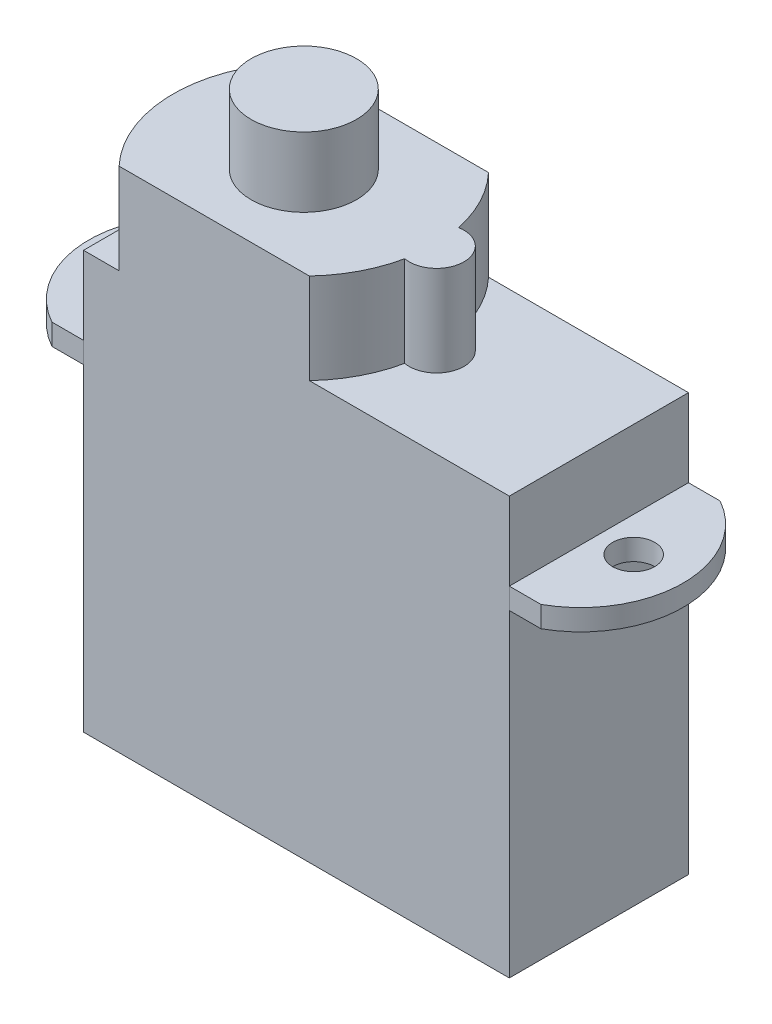
ISO-10303-21;
HEADER;
FILE_DESCRIPTION(('STEP AP214'),'2;1');
FILE_NAME('part.step','',(''),(''),'','','');
FILE_SCHEMA(('AUTOMOTIVE_DESIGN { 1 0 10303 214 1 1 1 1 }'));
ENDSEC;
DATA;
#1=APPLICATION_CONTEXT('core data for automotive mechanical design processes');
#2=APPLICATION_PROTOCOL_DEFINITION('international standard','automotive_design',2000,#1);
#3=PRODUCT_CONTEXT('',#1,'mechanical');
#4=PRODUCT('Part','Part','',(#3));
#5=PRODUCT_RELATED_PRODUCT_CATEGORY('part','',(#4));
#6=PRODUCT_DEFINITION_FORMATION('','',#4);
#7=PRODUCT_DEFINITION_CONTEXT('part definition',#1,'design');
#8=PRODUCT_DEFINITION('design','',#6,#7);
#9=PRODUCT_DEFINITION_SHAPE('','',#8);
#10=(LENGTH_UNIT() NAMED_UNIT(*) SI_UNIT(.MILLI.,.METRE.));
#11=(NAMED_UNIT(*) PLANE_ANGLE_UNIT() SI_UNIT($,.RADIAN.));
#12=(NAMED_UNIT(*) SI_UNIT($,.STERADIAN.) SOLID_ANGLE_UNIT());
#13=UNCERTAINTY_MEASURE_WITH_UNIT(LENGTH_MEASURE(1.E-05),#10,'distance_accuracy_value','');
#14=(GEOMETRIC_REPRESENTATION_CONTEXT(3) GLOBAL_UNCERTAINTY_ASSIGNED_CONTEXT((#13)) GLOBAL_UNIT_ASSIGNED_CONTEXT((#10,
#11,#12)) REPRESENTATION_CONTEXT('',''));
#15=CARTESIAN_POINT('',(0.,0.,0.));
#16=DIRECTION('',(0.,0.,1.));
#17=DIRECTION('',(1.,0.,0.));
#18=AXIS2_PLACEMENT_3D('',#15,#16,#17);
#19=CARTESIAN_POINT('',(-12.4,4.5,1.2));
#20=DIRECTION('',(1.,0.,0.));
#21=DIRECTION('',(0.,0.,-1.));
#22=AXIS2_PLACEMENT_3D('',#19,#20,#21);
#23=CYLINDRICAL_SURFACE('',#22,0.6);
#24=CARTESIAN_POINT('',(-12.4,4.5,1.2));
#25=DIRECTION('',(-1.,0.,0.));
#26=DIRECTION('',(0.,0.,1.));
#27=AXIS2_PLACEMENT_3D('',#24,#25,#26);
#28=CIRCLE('',#27,0.6);
#29=CARTESIAN_POINT('',(-12.4,4.5,1.8));
#30=VERTEX_POINT('',#29);
#31=EDGE_CURVE('E12',#30,#30,#28,.T.);
#32=ORIENTED_EDGE('',*,*,#31,.F.);
#33=EDGE_LOOP('',(#32));
#34=FACE_BOUND('',#33,.T.);
#35=CARTESIAN_POINT('',(-10.1,4.5,1.2));
#36=DIRECTION('',(-1.,0.,0.));
#37=DIRECTION('',(0.,0.,1.));
#38=AXIS2_PLACEMENT_3D('',#35,#36,#37);
#39=CIRCLE('',#38,0.6);
#40=CARTESIAN_POINT('',(-10.1,4.5,1.8));
#41=VERTEX_POINT('',#40);
#42=EDGE_CURVE('E68',#41,#41,#39,.T.);
#43=ORIENTED_EDGE('',*,*,#42,.T.);
#44=EDGE_LOOP('',(#43));
#45=FACE_BOUND('',#44,.T.);
#46=ADVANCED_FACE('F65',(#34,#45),#23,.T.);
#47=CARTESIAN_POINT('',(-12.4,0.,0.));
#48=DIRECTION('',(-1.,0.,0.));
#49=DIRECTION('',(0.,0.,1.));
#50=AXIS2_PLACEMENT_3D('',#47,#48,#49);
#51=PLANE('',#50);
#52=ORIENTED_EDGE('',*,*,#31,.T.);
#53=EDGE_LOOP('',(#52));
#54=FACE_BOUND('',#53,.T.);
#55=ADVANCED_FACE('F80',(#54),#51,.T.);
#56=CARTESIAN_POINT('',(-10.1,0.,0.));
#57=DIRECTION('',(-1.,0.,0.));
#58=DIRECTION('',(0.,0.,1.));
#59=AXIS2_PLACEMENT_3D('',#56,#57,#58);
#60=PLANE('',#59);
#61=ORIENTED_EDGE('',*,*,#42,.F.);
#62=EDGE_LOOP('',(#61));
#63=FACE_BOUND('',#62,.T.);
#64=ADVANCED_FACE('F78',(#63),#60,.F.);
#65=CLOSED_SHELL('',(#46,#55,#64));
#66=MANIFOLD_SOLID_BREP('B2',#65);
#67=CARTESIAN_POINT('',(-12.4,4.5,-1.2));
#68=DIRECTION('',(1.,0.,0.));
#69=DIRECTION('',(0.,0.,-1.));
#70=AXIS2_PLACEMENT_3D('',#67,#68,#69);
#71=CYLINDRICAL_SURFACE('',#70,0.6);
#72=CARTESIAN_POINT('',(-12.4,4.5,-1.2));
#73=DIRECTION('',(-1.,0.,0.));
#74=DIRECTION('',(0.,0.,1.));
#75=AXIS2_PLACEMENT_3D('',#72,#73,#74);
#76=CIRCLE('',#75,0.6);
#77=CARTESIAN_POINT('',(-12.4,4.5,-0.600000000000001));
#78=VERTEX_POINT('',#77);
#79=EDGE_CURVE('E64',#78,#78,#76,.T.);
#80=ORIENTED_EDGE('',*,*,#79,.F.);
#81=EDGE_LOOP('',(#80));
#82=FACE_BOUND('',#81,.T.);
#83=CARTESIAN_POINT('',(-10.1,4.5,-1.2));
#84=DIRECTION('',(-1.,0.,0.));
#85=DIRECTION('',(0.,0.,1.));
#86=AXIS2_PLACEMENT_3D('',#83,#84,#85);
#87=CIRCLE('',#86,0.6);
#88=CARTESIAN_POINT('',(-10.1,4.5,-0.600000000000001));
#89=VERTEX_POINT('',#88);
#90=EDGE_CURVE('E133',#89,#89,#87,.T.);
#91=ORIENTED_EDGE('',*,*,#90,.T.);
#92=EDGE_LOOP('',(#91));
#93=FACE_BOUND('',#92,.T.);
#94=ADVANCED_FACE('F130',(#82,#93),#71,.T.);
#95=CARTESIAN_POINT('',(-12.4,0.,0.));
#96=DIRECTION('',(-1.,0.,0.));
#97=DIRECTION('',(0.,0.,1.));
#98=AXIS2_PLACEMENT_3D('',#95,#96,#97);
#99=PLANE('',#98);
#100=ORIENTED_EDGE('',*,*,#79,.T.);
#101=EDGE_LOOP('',(#100));
#102=FACE_BOUND('',#101,.T.);
#103=ADVANCED_FACE('F145',(#102),#99,.T.);
#104=CARTESIAN_POINT('',(-10.1,0.,0.));
#105=DIRECTION('',(-1.,0.,0.));
#106=DIRECTION('',(0.,0.,1.));
#107=AXIS2_PLACEMENT_3D('',#104,#105,#106);
#108=PLANE('',#107);
#109=ORIENTED_EDGE('',*,*,#90,.F.);
#110=EDGE_LOOP('',(#109));
#111=FACE_BOUND('',#110,.T.);
#112=ADVANCED_FACE('F143',(#111),#108,.F.);
#113=CLOSED_SHELL('',(#94,#103,#112));
#114=MANIFOLD_SOLID_BREP('B7',#113);
#115=CARTESIAN_POINT('',(-12.4,4.5,0.));
#116=DIRECTION('',(1.,0.,0.));
#117=DIRECTION('',(0.,0.,-1.));
#118=AXIS2_PLACEMENT_3D('',#115,#116,#117);
#119=CYLINDRICAL_SURFACE('',#118,0.6);
#120=CARTESIAN_POINT('',(-12.4,4.5,0.));
#121=DIRECTION('',(-1.,0.,0.));
#122=DIRECTION('',(0.,0.,1.));
#123=AXIS2_PLACEMENT_3D('',#120,#121,#122);
#124=CIRCLE('',#123,0.6);
#125=CARTESIAN_POINT('',(-12.4,4.5,0.599999999999999));
#126=VERTEX_POINT('',#125);
#127=EDGE_CURVE('E129',#126,#126,#124,.T.);
#128=ORIENTED_EDGE('',*,*,#127,.F.);
#129=EDGE_LOOP('',(#128));
#130=FACE_BOUND('',#129,.T.);
#131=CARTESIAN_POINT('',(-10.1,4.5,0.));
#132=DIRECTION('',(-1.,0.,0.));
#133=DIRECTION('',(0.,0.,1.));
#134=AXIS2_PLACEMENT_3D('',#131,#132,#133);
#135=CIRCLE('',#134,0.6);
#136=CARTESIAN_POINT('',(-10.1,4.5,0.599999999999999));
#137=VERTEX_POINT('',#136);
#138=EDGE_CURVE('E200',#137,#137,#135,.T.);
#139=ORIENTED_EDGE('',*,*,#138,.T.);
#140=EDGE_LOOP('',(#139));
#141=FACE_BOUND('',#140,.T.);
#142=ADVANCED_FACE('F197',(#130,#141),#119,.T.);
#143=CARTESIAN_POINT('',(-12.4,0.,0.));
#144=DIRECTION('',(-1.,0.,0.));
#145=DIRECTION('',(0.,0.,1.));
#146=AXIS2_PLACEMENT_3D('',#143,#144,#145);
#147=PLANE('',#146);
#148=ORIENTED_EDGE('',*,*,#127,.T.);
#149=EDGE_LOOP('',(#148));
#150=FACE_BOUND('',#149,.T.);
#151=ADVANCED_FACE('F212',(#150),#147,.T.);
#152=CARTESIAN_POINT('',(-10.1,0.,0.));
#153=DIRECTION('',(-1.,0.,0.));
#154=DIRECTION('',(0.,0.,1.));
#155=AXIS2_PLACEMENT_3D('',#152,#153,#154);
#156=PLANE('',#155);
#157=ORIENTED_EDGE('',*,*,#138,.F.);
#158=EDGE_LOOP('',(#157));
#159=FACE_BOUND('',#158,.T.);
#160=ADVANCED_FACE('F210',(#159),#156,.F.);
#161=CLOSED_SHELL('',(#142,#151,#160));
#162=MANIFOLD_SOLID_BREP('B59',#161);
#163=CARTESIAN_POINT('',(-15.1,16.1,4.25));
#164=DIRECTION('',(0.,-1.,0.));
#165=DIRECTION('',(0.,0.,-1.));
#166=AXIS2_PLACEMENT_3D('',#163,#164,#165);
#167=PLANE('',#166);
#168=CARTESIAN_POINT('',(-11.75,16.1,0.));
#169=DIRECTION('',(0.,1.,0.));
#170=DIRECTION('',(0.,0.,1.));
#171=AXIS2_PLACEMENT_3D('',#168,#169,#170);
#172=CIRCLE('',#171,1.);
#173=CARTESIAN_POINT('',(-11.75,16.1,1.));
#174=VERTEX_POINT('',#173);
#175=EDGE_CURVE('E309',#174,#174,#172,.T.);
#176=ORIENTED_EDGE('',*,*,#175,.F.);
#177=EDGE_LOOP('',(#176));
#178=FACE_BOUND('',#177,.T.);
#179=CARTESIAN_POINT('',(-9.2375,16.1,0.));
#180=DIRECTION('',(0.,1.,0.));
#181=DIRECTION('',(0.,0.,1.));
#182=AXIS2_PLACEMENT_3D('',#179,#180,#181);
#183=CIRCLE('',#182,4.8625);
#184=CARTESIAN_POINT('',(-11.6,16.1,-4.25));
#185=VERTEX_POINT('',#184);
#186=CARTESIAN_POINT('',(-11.6,16.1,4.25));
#187=VERTEX_POINT('',#186);
#188=EDGE_CURVE('E303',#185,#187,#183,.T.);
#189=ORIENTED_EDGE('',*,*,#188,.T.);
#190=DIRECTION('',(1.,0.,0.));
#191=VECTOR('',#190,1.);
#192=CARTESIAN_POINT('',(-15.1,16.1,4.25));
#193=LINE('',#192,#191);
#194=CARTESIAN_POINT('',(-10.1,16.1,4.25));
#195=VERTEX_POINT('',#194);
#196=EDGE_CURVE('E287',#187,#195,#193,.T.);
#197=ORIENTED_EDGE('',*,*,#196,.T.);
#198=DIRECTION('',(0.,0.,-1.));
#199=VECTOR('',#198,1.);
#200=CARTESIAN_POINT('',(-10.1,16.1,4.25));
#201=LINE('',#200,#199);
#202=CARTESIAN_POINT('',(-10.1,16.1,-4.25));
#203=VERTEX_POINT('',#202);
#204=EDGE_CURVE('E318',#195,#203,#201,.T.);
#205=ORIENTED_EDGE('',*,*,#204,.T.);
#206=DIRECTION('',(1.,0.,0.));
#207=VECTOR('',#206,1.);
#208=CARTESIAN_POINT('',(-15.1,16.1,-4.25));
#209=LINE('',#208,#207);
#210=EDGE_CURVE('E195',#185,#203,#209,.T.);
#211=ORIENTED_EDGE('',*,*,#210,.F.);
#212=EDGE_LOOP('',(#189,#197,#205,#211));
#213=FACE_BOUND('',#212,.T.);
#214=ADVANCED_FACE('F264',(#178,#213),#167,.F.);
#215=CARTESIAN_POINT('',(-15.1,16.1,-4.25));
#216=DIRECTION('',(0.,0.,1.));
#217=DIRECTION('',(0.,-1.,0.));
#218=AXIS2_PLACEMENT_3D('',#215,#216,#217);
#219=PLANE('',#218);
#220=DIRECTION('',(0.,1.,0.));
#221=VECTOR('',#220,1.);
#222=CARTESIAN_POINT('',(-11.6,13.6,-4.25));
#223=LINE('',#222,#221);
#224=CARTESIAN_POINT('',(-11.6,15.1,-4.25));
#225=VERTEX_POINT('',#224);
#226=EDGE_CURVE('E306',#225,#185,#223,.T.);
#227=ORIENTED_EDGE('',*,*,#226,.T.);
#228=ORIENTED_EDGE('',*,*,#210,.T.);
#229=DIRECTION('',(0.,-1.,0.));
#230=VECTOR('',#229,1.);
#231=CARTESIAN_POINT('',(-10.1,16.1,-4.25));
#232=LINE('',#231,#230);
#233=CARTESIAN_POINT('',(-10.1,15.1,-4.25));
#234=VERTEX_POINT('',#233);
#235=EDGE_CURVE('E321',#203,#234,#232,.T.);
#236=ORIENTED_EDGE('',*,*,#235,.T.);
#237=DIRECTION('',(1.,0.,0.));
#238=VECTOR('',#237,1.);
#239=CARTESIAN_POINT('',(-15.1,15.1,-4.25));
#240=LINE('',#239,#238);
#241=EDGE_CURVE('E272',#225,#234,#240,.T.);
#242=ORIENTED_EDGE('',*,*,#241,.F.);
#243=EDGE_LOOP('',(#227,#228,#236,#242));
#244=FACE_BOUND('',#243,.T.);
#245=ADVANCED_FACE('F313',(#244),#219,.F.);
#246=CARTESIAN_POINT('',(-15.1,15.1,-4.25));
#247=DIRECTION('',(0.,1.,0.));
#248=DIRECTION('',(0.,0.,1.));
#249=AXIS2_PLACEMENT_3D('',#246,#247,#248);
#250=PLANE('',#249);
#251=CARTESIAN_POINT('',(-11.75,15.1,0.));
#252=DIRECTION('',(0.,1.,0.));
#253=DIRECTION('',(0.,0.,1.));
#254=AXIS2_PLACEMENT_3D('',#251,#252,#253);
#255=CIRCLE('',#254,1.);
#256=CARTESIAN_POINT('',(-11.75,15.1,1.));
#257=VERTEX_POINT('',#256);
#258=EDGE_CURVE('E267',#257,#257,#255,.T.);
#259=ORIENTED_EDGE('',*,*,#258,.T.);
#260=EDGE_LOOP('',(#259));
#261=FACE_BOUND('',#260,.T.);
#262=CARTESIAN_POINT('',(-9.2375,15.1,0.));
#263=DIRECTION('',(0.,1.,0.));
#264=DIRECTION('',(0.,0.,1.));
#265=AXIS2_PLACEMENT_3D('',#262,#263,#264);
#266=CIRCLE('',#265,4.8625);
#267=CARTESIAN_POINT('',(-11.6,15.1,4.25));
#268=VERTEX_POINT('',#267);
#269=EDGE_CURVE('E279',#225,#268,#266,.T.);
#270=ORIENTED_EDGE('',*,*,#269,.F.);
#271=ORIENTED_EDGE('',*,*,#241,.T.);
#272=DIRECTION('',(0.,0.,1.));
#273=VECTOR('',#272,1.);
#274=CARTESIAN_POINT('',(-10.1,15.1,-4.25));
#275=LINE('',#274,#273);
#276=CARTESIAN_POINT('',(-10.1,15.1,4.25));
#277=VERTEX_POINT('',#276);
#278=EDGE_CURVE('E323',#234,#277,#275,.T.);
#279=ORIENTED_EDGE('',*,*,#278,.T.);
#280=DIRECTION('',(1.,0.,0.));
#281=VECTOR('',#280,1.);
#282=CARTESIAN_POINT('',(-15.1,15.1,4.25));
#283=LINE('',#282,#281);
#284=EDGE_CURVE('E333',#268,#277,#283,.T.);
#285=ORIENTED_EDGE('',*,*,#284,.F.);
#286=EDGE_LOOP('',(#270,#271,#279,#285));
#287=FACE_BOUND('',#286,.T.);
#288=ADVANCED_FACE('F336',(#261,#287),#250,.F.);
#289=CARTESIAN_POINT('',(-15.1,15.1,4.25));
#290=DIRECTION('',(0.,0.,-1.));
#291=DIRECTION('',(0.,1.,0.));
#292=AXIS2_PLACEMENT_3D('',#289,#290,#291);
#293=PLANE('',#292);
#294=DIRECTION('',(0.,1.,0.));
#295=VECTOR('',#294,1.);
#296=CARTESIAN_POINT('',(-11.6,13.6,4.25));
#297=LINE('',#296,#295);
#298=EDGE_CURVE('E307',#268,#187,#297,.T.);
#299=ORIENTED_EDGE('',*,*,#298,.F.);
#300=ORIENTED_EDGE('',*,*,#284,.T.);
#301=DIRECTION('',(0.,1.,0.));
#302=VECTOR('',#301,1.);
#303=CARTESIAN_POINT('',(-10.1,15.1,4.25));
#304=LINE('',#303,#302);
#305=EDGE_CURVE('E330',#277,#195,#304,.T.);
#306=ORIENTED_EDGE('',*,*,#305,.T.);
#307=ORIENTED_EDGE('',*,*,#196,.F.);
#308=EDGE_LOOP('',(#299,#300,#306,#307));
#309=FACE_BOUND('',#308,.T.);
#310=ADVANCED_FACE('F341',(#309),#293,.F.);
#311=CARTESIAN_POINT('',(-10.1,0.,0.));
#312=DIRECTION('',(-1.,0.,0.));
#313=DIRECTION('',(0.,0.,1.));
#314=AXIS2_PLACEMENT_3D('',#311,#312,#313);
#315=PLANE('',#314);
#316=ORIENTED_EDGE('',*,*,#204,.F.);
#317=ORIENTED_EDGE('',*,*,#305,.F.);
#318=ORIENTED_EDGE('',*,*,#278,.F.);
#319=ORIENTED_EDGE('',*,*,#235,.F.);
#320=EDGE_LOOP('',(#316,#317,#318,#319));
#321=FACE_BOUND('',#320,.T.);
#322=ADVANCED_FACE('F339',(#321),#315,.F.);
#323=CARTESIAN_POINT('',(-9.2375,13.6,0.));
#324=DIRECTION('',(0.,1.,0.));
#325=DIRECTION('',(0.,0.,1.));
#326=AXIS2_PLACEMENT_3D('',#323,#324,#325);
#327=CYLINDRICAL_SURFACE('',#326,4.8625);
#328=ORIENTED_EDGE('',*,*,#269,.T.);
#329=ORIENTED_EDGE('',*,*,#298,.T.);
#330=ORIENTED_EDGE('',*,*,#188,.F.);
#331=ORIENTED_EDGE('',*,*,#226,.F.);
#332=EDGE_LOOP('',(#328,#329,#330,#331));
#333=FACE_BOUND('',#332,.T.);
#334=ADVANCED_FACE('F305',(#333),#327,.T.);
#335=CARTESIAN_POINT('',(-11.75,13.6,0.));
#336=DIRECTION('',(0.,1.,0.));
#337=DIRECTION('',(0.,0.,1.));
#338=AXIS2_PLACEMENT_3D('',#335,#336,#337);
#339=CYLINDRICAL_SURFACE('',#338,1.);
#340=ORIENTED_EDGE('',*,*,#175,.T.);
#341=EDGE_LOOP('',(#340));
#342=FACE_BOUND('',#341,.T.);
#343=ORIENTED_EDGE('',*,*,#258,.F.);
#344=EDGE_LOOP('',(#343));
#345=FACE_BOUND('',#344,.T.);
#346=ADVANCED_FACE('F347',(#342,#345),#339,.F.);
#347=CLOSED_SHELL('',(#214,#245,#288,#310,#322,#334,#346));
#348=MANIFOLD_SOLID_BREP('B124',#347);
#349=CARTESIAN_POINT('',(15.1,16.1,4.25));
#350=DIRECTION('',(0.,0.,-1.));
#351=DIRECTION('',(0.,1.,0.));
#352=AXIS2_PLACEMENT_3D('',#349,#350,#351);
#353=PLANE('',#352);
#354=DIRECTION('',(0.,-1.,0.));
#355=VECTOR('',#354,1.);
#356=CARTESIAN_POINT('',(11.6,16.1,4.25));
#357=LINE('',#356,#355);
#358=CARTESIAN_POINT('',(11.6,16.1,4.25));
#359=VERTEX_POINT('',#358);
#360=CARTESIAN_POINT('',(11.6,15.1,4.25));
#361=VERTEX_POINT('',#360);
#362=EDGE_CURVE('E472',#359,#361,#357,.T.);
#363=ORIENTED_EDGE('',*,*,#362,.F.);
#364=DIRECTION('',(-1.,0.,0.));
#365=VECTOR('',#364,1.);
#366=CARTESIAN_POINT('',(15.1,16.1,4.25));
#367=LINE('',#366,#365);
#368=CARTESIAN_POINT('',(10.1,16.1,4.25));
#369=VERTEX_POINT('',#368);
#370=EDGE_CURVE('E485',#359,#369,#367,.T.);
#371=ORIENTED_EDGE('',*,*,#370,.T.);
#372=DIRECTION('',(0.,-1.,0.));
#373=VECTOR('',#372,1.);
#374=CARTESIAN_POINT('',(10.1,16.1,4.25));
#375=LINE('',#374,#373);
#376=CARTESIAN_POINT('',(10.1,15.1,4.25));
#377=VERTEX_POINT('',#376);
#378=EDGE_CURVE('E473',#369,#377,#375,.T.);
#379=ORIENTED_EDGE('',*,*,#378,.T.);
#380=DIRECTION('',(-1.,0.,0.));
#381=VECTOR('',#380,1.);
#382=CARTESIAN_POINT('',(15.1,15.1,4.25));
#383=LINE('',#382,#381);
#384=EDGE_CURVE('E262',#361,#377,#383,.T.);
#385=ORIENTED_EDGE('',*,*,#384,.F.);
#386=EDGE_LOOP('',(#363,#371,#379,#385));
#387=FACE_BOUND('',#386,.T.);
#388=ADVANCED_FACE('F418',(#387),#353,.F.);
#389=CARTESIAN_POINT('',(15.1,15.1,4.25));
#390=DIRECTION('',(0.,1.,0.));
#391=DIRECTION('',(0.,0.,1.));
#392=AXIS2_PLACEMENT_3D('',#389,#390,#391);
#393=PLANE('',#392);
#394=CARTESIAN_POINT('',(11.75,15.1,0.));
#395=DIRECTION('',(0.,1.,0.));
#396=DIRECTION('',(0.,0.,1.));
#397=AXIS2_PLACEMENT_3D('',#394,#395,#396);
#398=CIRCLE('',#397,1.);
#399=CARTESIAN_POINT('',(11.75,15.1,1.));
#400=VERTEX_POINT('',#399);
#401=EDGE_CURVE('E468',#400,#400,#398,.T.);
#402=ORIENTED_EDGE('',*,*,#401,.T.);
#403=EDGE_LOOP('',(#402));
#404=FACE_BOUND('',#403,.T.);
#405=CARTESIAN_POINT('',(9.2375,15.1,0.));
#406=DIRECTION('',(0.,1.,0.));
#407=DIRECTION('',(0.,0.,1.));
#408=AXIS2_PLACEMENT_3D('',#405,#406,#407);
#409=CIRCLE('',#408,4.8625);
#410=CARTESIAN_POINT('',(11.6,15.1,-4.25));
#411=VERTEX_POINT('',#410);
#412=EDGE_CURVE('E431',#361,#411,#409,.T.);
#413=ORIENTED_EDGE('',*,*,#412,.F.);
#414=ORIENTED_EDGE('',*,*,#384,.T.);
#415=DIRECTION('',(0.,0.,-1.));
#416=VECTOR('',#415,1.);
#417=CARTESIAN_POINT('',(10.1,15.1,4.25));
#418=LINE('',#417,#416);
#419=CARTESIAN_POINT('',(10.1,15.1,-4.25));
#420=VERTEX_POINT('',#419);
#421=EDGE_CURVE('E459',#377,#420,#418,.T.);
#422=ORIENTED_EDGE('',*,*,#421,.T.);
#423=DIRECTION('',(-1.,0.,0.));
#424=VECTOR('',#423,1.);
#425=CARTESIAN_POINT('',(15.1,15.1,-4.25));
#426=LINE('',#425,#424);
#427=EDGE_CURVE('E425',#411,#420,#426,.T.);
#428=ORIENTED_EDGE('',*,*,#427,.F.);
#429=EDGE_LOOP('',(#413,#414,#422,#428));
#430=FACE_BOUND('',#429,.T.);
#431=ADVANCED_FACE('F457',(#404,#430),#393,.F.);
#432=CARTESIAN_POINT('',(15.1,16.1,4.25));
#433=DIRECTION('',(0.,-1.,0.));
#434=DIRECTION('',(0.,0.,-1.));
#435=AXIS2_PLACEMENT_3D('',#432,#433,#434);
#436=PLANE('',#435);
#437=CARTESIAN_POINT('',(11.75,16.1,0.));
#438=DIRECTION('',(0.,1.,0.));
#439=DIRECTION('',(0.,0.,1.));
#440=AXIS2_PLACEMENT_3D('',#437,#438,#439);
#441=CIRCLE('',#440,1.);
#442=CARTESIAN_POINT('',(11.75,16.1,1.));
#443=VERTEX_POINT('',#442);
#444=EDGE_CURVE('E497',#443,#443,#441,.T.);
#445=ORIENTED_EDGE('',*,*,#444,.F.);
#446=EDGE_LOOP('',(#445));
#447=FACE_BOUND('',#446,.T.);
#448=CARTESIAN_POINT('',(9.2375,16.1,0.));
#449=DIRECTION('',(0.,-1.,0.));
#450=DIRECTION('',(0.,0.,-1.));
#451=AXIS2_PLACEMENT_3D('',#448,#449,#450);
#452=CIRCLE('',#451,4.8625);
#453=CARTESIAN_POINT('',(11.6,16.1,-4.25));
#454=VERTEX_POINT('',#453);
#455=EDGE_CURVE('E439',#454,#359,#452,.T.);
#456=ORIENTED_EDGE('',*,*,#455,.F.);
#457=DIRECTION('',(-1.,0.,0.));
#458=VECTOR('',#457,1.);
#459=CARTESIAN_POINT('',(15.1,16.1,-4.25));
#460=LINE('',#459,#458);
#461=CARTESIAN_POINT('',(10.1,16.1,-4.25));
#462=VERTEX_POINT('',#461);
#463=EDGE_CURVE('E463',#454,#462,#460,.T.);
#464=ORIENTED_EDGE('',*,*,#463,.T.);
#465=DIRECTION('',(0.,0.,1.));
#466=VECTOR('',#465,1.);
#467=CARTESIAN_POINT('',(10.1,16.1,4.25));
#468=LINE('',#467,#466);
#469=EDGE_CURVE('E482',#462,#369,#468,.T.);
#470=ORIENTED_EDGE('',*,*,#469,.T.);
#471=ORIENTED_EDGE('',*,*,#370,.F.);
#472=EDGE_LOOP('',(#456,#464,#470,#471));
#473=FACE_BOUND('',#472,.T.);
#474=ADVANCED_FACE('F487',(#447,#473),#436,.F.);
#475=CARTESIAN_POINT('',(15.1,16.1,-4.25));
#476=DIRECTION('',(0.,0.,1.));
#477=DIRECTION('',(0.,-1.,0.));
#478=AXIS2_PLACEMENT_3D('',#475,#476,#477);
#479=PLANE('',#478);
#480=ORIENTED_EDGE('',*,*,#463,.F.);
#481=DIRECTION('',(0.,-1.,0.));
#482=VECTOR('',#481,1.);
#483=CARTESIAN_POINT('',(11.6,16.1,-4.25));
#484=LINE('',#483,#482);
#485=EDGE_CURVE('E465',#454,#411,#484,.T.);
#486=ORIENTED_EDGE('',*,*,#485,.T.);
#487=ORIENTED_EDGE('',*,*,#427,.T.);
#488=DIRECTION('',(0.,1.,0.));
#489=VECTOR('',#488,1.);
#490=CARTESIAN_POINT('',(10.1,16.1,-4.25));
#491=LINE('',#490,#489);
#492=EDGE_CURVE('E480',#420,#462,#491,.T.);
#493=ORIENTED_EDGE('',*,*,#492,.T.);
#494=EDGE_LOOP('',(#480,#486,#487,#493));
#495=FACE_BOUND('',#494,.T.);
#496=ADVANCED_FACE('F466',(#495),#479,.F.);
#497=CARTESIAN_POINT('',(10.1,0.,0.));
#498=DIRECTION('',(1.,0.,0.));
#499=DIRECTION('',(0.,0.,-1.));
#500=AXIS2_PLACEMENT_3D('',#497,#498,#499);
#501=PLANE('',#500);
#502=ORIENTED_EDGE('',*,*,#378,.F.);
#503=ORIENTED_EDGE('',*,*,#469,.F.);
#504=ORIENTED_EDGE('',*,*,#492,.F.);
#505=ORIENTED_EDGE('',*,*,#421,.F.);
#506=EDGE_LOOP('',(#502,#503,#504,#505));
#507=FACE_BOUND('',#506,.T.);
#508=ADVANCED_FACE('F491',(#507),#501,.F.);
#509=CARTESIAN_POINT('',(9.2375,16.1,0.));
#510=DIRECTION('',(0.,-1.,0.));
#511=DIRECTION('',(0.,0.,-1.));
#512=AXIS2_PLACEMENT_3D('',#509,#510,#511);
#513=CYLINDRICAL_SURFACE('',#512,4.8625);
#514=ORIENTED_EDGE('',*,*,#362,.T.);
#515=ORIENTED_EDGE('',*,*,#412,.T.);
#516=ORIENTED_EDGE('',*,*,#485,.F.);
#517=ORIENTED_EDGE('',*,*,#455,.T.);
#518=EDGE_LOOP('',(#514,#515,#516,#517));
#519=FACE_BOUND('',#518,.T.);
#520=ADVANCED_FACE('F471',(#519),#513,.T.);
#521=CARTESIAN_POINT('',(11.75,0.,0.));
#522=DIRECTION('',(0.,1.,0.));
#523=DIRECTION('',(0.,0.,1.));
#524=AXIS2_PLACEMENT_3D('',#521,#522,#523);
#525=CYLINDRICAL_SURFACE('',#524,1.);
#526=ORIENTED_EDGE('',*,*,#444,.T.);
#527=EDGE_LOOP('',(#526));
#528=FACE_BOUND('',#527,.T.);
#529=ORIENTED_EDGE('',*,*,#401,.F.);
#530=EDGE_LOOP('',(#529));
#531=FACE_BOUND('',#530,.T.);
#532=ADVANCED_FACE('F501',(#528,#531),#525,.F.);
#533=CLOSED_SHELL('',(#388,#431,#474,#496,#508,#520,#532));
#534=MANIFOLD_SOLID_BREP('B189',#533);
#535=CARTESIAN_POINT('',(0.,19.8,0.));
#536=DIRECTION('',(0.,-1.,0.));
#537=DIRECTION('',(0.,0.,-1.));
#538=AXIS2_PLACEMENT_3D('',#535,#536,#537);
#539=PLANE('',#538);
#540=CARTESIAN_POINT('',(-3.9,19.8,0.));
#541=DIRECTION('',(0.,1.,0.));
#542=DIRECTION('',(0.,0.,1.));
#543=AXIS2_PLACEMENT_3D('',#540,#541,#542);
#544=CIRCLE('',#543,6.2);
#545=CARTESIAN_POINT('',(-8.41414443721067,19.8,-4.25));
#546=VERTEX_POINT('',#545);
#547=CARTESIAN_POINT('',(-10.1,19.8,0.));
#548=VERTEX_POINT('',#547);
#549=EDGE_CURVE('E715',#546,#548,#544,.T.);
#550=ORIENTED_EDGE('',*,*,#549,.F.);
#551=DIRECTION('',(-1.,0.,0.));
#552=VECTOR('',#551,1.);
#553=CARTESIAN_POINT('',(-10.1,19.8,-4.25));
#554=LINE('',#553,#552);
#555=CARTESIAN_POINT('',(-10.1,19.8,-4.25));
#556=VERTEX_POINT('',#555);
#557=EDGE_CURVE('E678',#546,#556,#554,.T.);
#558=ORIENTED_EDGE('',*,*,#557,.T.);
#559=DIRECTION('',(0.,0.,1.));
#560=VECTOR('',#559,1.);
#561=CARTESIAN_POINT('',(-10.1,19.8,4.25));
#562=LINE('',#561,#560);
#563=EDGE_CURVE('E683',#556,#548,#562,.T.);
#564=ORIENTED_EDGE('',*,*,#563,.T.);
#565=EDGE_LOOP('',(#550,#558,#564));
#566=FACE_BOUND('',#565,.T.);
#567=ADVANCED_FACE('F563',(#566),#539,.F.);
#568=CARTESIAN_POINT('',(-8.41414443721067,19.8,4.25));
#569=VERTEX_POINT('',#568);
#570=EDGE_CURVE('E572',#548,#569,#544,.T.);
#571=ORIENTED_EDGE('',*,*,#570,.F.);
#572=CARTESIAN_POINT('',(-10.1,19.8,4.25));
#573=VERTEX_POINT('',#572);
#574=EDGE_CURVE('E682',#548,#573,#562,.T.);
#575=ORIENTED_EDGE('',*,*,#574,.T.);
#576=DIRECTION('',(1.,0.,0.));
#577=VECTOR('',#576,1.);
#578=CARTESIAN_POINT('',(-10.1,19.8,4.25));
#579=LINE('',#578,#577);
#580=EDGE_CURVE('E687',#573,#569,#579,.T.);
#581=ORIENTED_EDGE('',*,*,#580,.T.);
#582=EDGE_LOOP('',(#571,#575,#581));
#583=FACE_BOUND('',#582,.T.);
#584=ADVANCED_FACE('F740',(#583),#539,.F.);
#585=CARTESIAN_POINT('',(10.1,19.8,4.25));
#586=DIRECTION('',(-1.,0.,0.));
#587=DIRECTION('',(0.,0.,1.));
#588=AXIS2_PLACEMENT_3D('',#585,#586,#587);
#589=PLANE('',#588);
#590=DIRECTION('',(0.,0.,-1.));
#591=VECTOR('',#590,1.);
#592=CARTESIAN_POINT('',(10.1,0.,4.25));
#593=LINE('',#592,#591);
#594=CARTESIAN_POINT('',(10.1,0.,4.25));
#595=VERTEX_POINT('',#594);
#596=CARTESIAN_POINT('',(10.1,0.,-4.25));
#597=VERTEX_POINT('',#596);
#598=EDGE_CURVE('E666',#595,#597,#593,.T.);
#599=ORIENTED_EDGE('',*,*,#598,.T.);
#600=DIRECTION('',(0.,-1.,0.));
#601=VECTOR('',#600,1.);
#602=CARTESIAN_POINT('',(10.1,19.8,-4.25));
#603=LINE('',#602,#601);
#604=CARTESIAN_POINT('',(10.1,19.8,-4.25));
#605=VERTEX_POINT('',#604);
#606=EDGE_CURVE('E567',#605,#597,#603,.T.);
#607=ORIENTED_EDGE('',*,*,#606,.F.);
#608=DIRECTION('',(0.,0.,-1.));
#609=VECTOR('',#608,1.);
#610=CARTESIAN_POINT('',(10.1,19.8,4.25));
#611=LINE('',#610,#609);
#612=CARTESIAN_POINT('',(10.1,19.8,4.25));
#613=VERTEX_POINT('',#612);
#614=EDGE_CURVE('E675',#613,#605,#611,.T.);
#615=ORIENTED_EDGE('',*,*,#614,.F.);
#616=DIRECTION('',(0.,-1.,0.));
#617=VECTOR('',#616,1.);
#618=CARTESIAN_POINT('',(10.1,19.8,4.25));
#619=LINE('',#618,#617);
#620=EDGE_CURVE('E688',#613,#595,#619,.T.);
#621=ORIENTED_EDGE('',*,*,#620,.T.);
#622=EDGE_LOOP('',(#599,#607,#615,#621));
#623=FACE_BOUND('',#622,.T.);
#624=ADVANCED_FACE('F565',(#623),#589,.F.);
#625=CARTESIAN_POINT('',(-10.1,19.8,-4.25));
#626=DIRECTION('',(0.,0.,1.));
#627=DIRECTION('',(1.,0.,0.));
#628=AXIS2_PLACEMENT_3D('',#625,#626,#627);
#629=PLANE('',#628);
#630=DIRECTION('',(-1.,0.,0.));
#631=VECTOR('',#630,1.);
#632=CARTESIAN_POINT('',(-10.1,0.,-4.25));
#633=LINE('',#632,#631);
#634=CARTESIAN_POINT('',(-10.1,0.,-4.25));
#635=VERTEX_POINT('',#634);
#636=EDGE_CURVE('E669',#597,#635,#633,.T.);
#637=ORIENTED_EDGE('',*,*,#636,.T.);
#638=DIRECTION('',(0.,-1.,0.));
#639=VECTOR('',#638,1.);
#640=CARTESIAN_POINT('',(-10.1,19.8,-4.25));
#641=LINE('',#640,#639);
#642=EDGE_CURVE('E698',#556,#635,#641,.T.);
#643=ORIENTED_EDGE('',*,*,#642,.F.);
#644=ORIENTED_EDGE('',*,*,#557,.F.);
#645=DIRECTION('',(0.,-1.,0.));
#646=VECTOR('',#645,1.);
#647=CARTESIAN_POINT('',(-8.41414443721067,24.1,-4.25));
#648=LINE('',#647,#646);
#649=CARTESIAN_POINT('',(-8.41414443721067,24.1,-4.25));
#650=VERTEX_POINT('',#649);
#651=EDGE_CURVE('E671',#650,#546,#648,.T.);
#652=ORIENTED_EDGE('',*,*,#651,.F.);
#653=DIRECTION('',(-1.,0.,0.));
#654=VECTOR('',#653,1.);
#655=CARTESIAN_POINT('',(0.,24.1,-4.25));
#656=LINE('',#655,#654);
#657=CARTESIAN_POINT('',(0.614144437210663,24.1,-4.25));
#658=VERTEX_POINT('',#657);
#659=EDGE_CURVE('E652',#658,#650,#656,.T.);
#660=ORIENTED_EDGE('',*,*,#659,.F.);
#661=DIRECTION('',(0.,-1.,0.));
#662=VECTOR('',#661,1.);
#663=CARTESIAN_POINT('',(0.614144437210663,24.1,-4.25));
#664=LINE('',#663,#662);
#665=CARTESIAN_POINT('',(0.614144437210663,19.8,-4.25));
#666=VERTEX_POINT('',#665);
#667=EDGE_CURVE('E649',#658,#666,#664,.T.);
#668=ORIENTED_EDGE('',*,*,#667,.T.);
#669=EDGE_CURVE('E680',#605,#666,#554,.T.);
#670=ORIENTED_EDGE('',*,*,#669,.F.);
#671=ORIENTED_EDGE('',*,*,#606,.T.);
#672=EDGE_LOOP('',(#637,#643,#644,#652,#660,#668,#670,#671));
#673=FACE_BOUND('',#672,.T.);
#674=ADVANCED_FACE('F733',(#673),#629,.F.);
#675=CARTESIAN_POINT('',(-10.1,19.8,4.25));
#676=DIRECTION('',(1.,0.,0.));
#677=DIRECTION('',(0.,0.,-1.));
#678=AXIS2_PLACEMENT_3D('',#675,#676,#677);
#679=PLANE('',#678);
#680=DIRECTION('',(0.,0.,1.));
#681=VECTOR('',#680,1.);
#682=CARTESIAN_POINT('',(-10.1,0.,4.25));
#683=LINE('',#682,#681);
#684=CARTESIAN_POINT('',(-10.1,0.,4.25));
#685=VERTEX_POINT('',#684);
#686=EDGE_CURVE('E691',#635,#685,#683,.T.);
#687=ORIENTED_EDGE('',*,*,#686,.T.);
#688=DIRECTION('',(0.,-1.,0.));
#689=VECTOR('',#688,1.);
#690=CARTESIAN_POINT('',(-10.1,19.8,4.25));
#691=LINE('',#690,#689);
#692=EDGE_CURVE('E696',#573,#685,#691,.T.);
#693=ORIENTED_EDGE('',*,*,#692,.F.);
#694=ORIENTED_EDGE('',*,*,#574,.F.);
#695=ORIENTED_EDGE('',*,*,#563,.F.);
#696=ORIENTED_EDGE('',*,*,#642,.T.);
#697=EDGE_LOOP('',(#687,#693,#694,#695,#696));
#698=FACE_BOUND('',#697,.T.);
#699=ADVANCED_FACE('F736',(#698),#679,.F.);
#700=CARTESIAN_POINT('',(-10.1,19.8,4.25));
#701=DIRECTION('',(0.,0.,-1.));
#702=DIRECTION('',(-1.,0.,0.));
#703=AXIS2_PLACEMENT_3D('',#700,#701,#702);
#704=PLANE('',#703);
#705=DIRECTION('',(1.,0.,0.));
#706=VECTOR('',#705,1.);
#707=CARTESIAN_POINT('',(-10.1,0.,4.25));
#708=LINE('',#707,#706);
#709=EDGE_CURVE('E679',#685,#595,#708,.T.);
#710=ORIENTED_EDGE('',*,*,#709,.T.);
#711=ORIENTED_EDGE('',*,*,#620,.F.);
#712=CARTESIAN_POINT('',(0.614144437210661,19.8,4.25));
#713=VERTEX_POINT('',#712);
#714=EDGE_CURVE('E686',#713,#613,#579,.T.);
#715=ORIENTED_EDGE('',*,*,#714,.F.);
#716=DIRECTION('',(0.,-1.,0.));
#717=VECTOR('',#716,1.);
#718=CARTESIAN_POINT('',(0.614144437210661,24.1,4.25));
#719=LINE('',#718,#717);
#720=CARTESIAN_POINT('',(0.614144437210661,24.1,4.25));
#721=VERTEX_POINT('',#720);
#722=EDGE_CURVE('E725',#721,#713,#719,.T.);
#723=ORIENTED_EDGE('',*,*,#722,.F.);
#724=DIRECTION('',(1.,0.,0.));
#725=VECTOR('',#724,1.);
#726=CARTESIAN_POINT('',(0.,24.1,4.25));
#727=LINE('',#726,#725);
#728=CARTESIAN_POINT('',(-8.41414443721067,24.1,4.25));
#729=VERTEX_POINT('',#728);
#730=EDGE_CURVE('E720',#729,#721,#727,.T.);
#731=ORIENTED_EDGE('',*,*,#730,.F.);
#732=DIRECTION('',(0.,-1.,0.));
#733=VECTOR('',#732,1.);
#734=CARTESIAN_POINT('',(-8.41414443721067,24.1,4.25));
#735=LINE('',#734,#733);
#736=EDGE_CURVE('E727',#729,#569,#735,.T.);
#737=ORIENTED_EDGE('',*,*,#736,.T.);
#738=ORIENTED_EDGE('',*,*,#580,.F.);
#739=ORIENTED_EDGE('',*,*,#692,.T.);
#740=EDGE_LOOP('',(#710,#711,#715,#723,#731,#737,#738,#739));
#741=FACE_BOUND('',#740,.T.);
#742=ADVANCED_FACE('F742',(#741),#704,.F.);
#743=CARTESIAN_POINT('',(2.16666666666666,19.8,1.27888840621673));
#744=VERTEX_POINT('',#743);
#745=EDGE_CURVE('E663',#713,#744,#544,.T.);
#746=ORIENTED_EDGE('',*,*,#745,.F.);
#747=ORIENTED_EDGE('',*,*,#714,.T.);
#748=ORIENTED_EDGE('',*,*,#614,.T.);
#749=ORIENTED_EDGE('',*,*,#669,.T.);
#750=CARTESIAN_POINT('',(2.16666666666666,19.8,-1.27888840621672));
#751=VERTEX_POINT('',#750);
#752=EDGE_CURVE('E585',#751,#666,#544,.T.);
#753=ORIENTED_EDGE('',*,*,#752,.F.);
#754=CARTESIAN_POINT('',(2.4,19.8,0.));
#755=DIRECTION('',(0.,1.,0.));
#756=DIRECTION('',(0.,0.,1.));
#757=AXIS2_PLACEMENT_3D('',#754,#755,#756);
#758=CIRCLE('',#757,1.3);
#759=EDGE_CURVE('E580',#744,#751,#758,.T.);
#760=ORIENTED_EDGE('',*,*,#759,.F.);
#761=EDGE_LOOP('',(#746,#747,#748,#749,#753,#760));
#762=FACE_BOUND('',#761,.T.);
#763=ADVANCED_FACE('F750',(#762),#539,.F.);
#764=CARTESIAN_POINT('',(0.,0.,0.));
#765=DIRECTION('',(0.,-1.,0.));
#766=DIRECTION('',(0.,0.,-1.));
#767=AXIS2_PLACEMENT_3D('',#764,#765,#766);
#768=PLANE('',#767);
#769=ORIENTED_EDGE('',*,*,#598,.F.);
#770=ORIENTED_EDGE('',*,*,#709,.F.);
#771=ORIENTED_EDGE('',*,*,#686,.F.);
#772=ORIENTED_EDGE('',*,*,#636,.F.);
#773=EDGE_LOOP('',(#769,#770,#771,#772));
#774=FACE_BOUND('',#773,.T.);
#775=ADVANCED_FACE('F755',(#774),#768,.T.);
#776=CARTESIAN_POINT('',(2.4,24.1,0.));
#777=DIRECTION('',(0.,-1.,0.));
#778=DIRECTION('',(0.,0.,-1.));
#779=AXIS2_PLACEMENT_3D('',#776,#777,#778);
#780=CYLINDRICAL_SURFACE('',#779,1.3);
#781=ORIENTED_EDGE('',*,*,#759,.T.);
#782=DIRECTION('',(0.,-1.,0.));
#783=VECTOR('',#782,1.);
#784=CARTESIAN_POINT('',(2.16666666666666,24.1,-1.27888840621672));
#785=LINE('',#784,#783);
#786=CARTESIAN_POINT('',(2.16666666666666,24.1,-1.27888840621672));
#787=VERTEX_POINT('',#786);
#788=EDGE_CURVE('E647',#787,#751,#785,.T.);
#789=ORIENTED_EDGE('',*,*,#788,.F.);
#790=CARTESIAN_POINT('',(2.4,24.1,0.));
#791=DIRECTION('',(0.,1.,0.));
#792=DIRECTION('',(0.,0.,1.));
#793=AXIS2_PLACEMENT_3D('',#790,#791,#792);
#794=CIRCLE('',#793,1.3);
#795=CARTESIAN_POINT('',(2.16666666666666,24.1,1.27888840621673));
#796=VERTEX_POINT('',#795);
#797=EDGE_CURVE('E653',#796,#787,#794,.T.);
#798=ORIENTED_EDGE('',*,*,#797,.F.);
#799=DIRECTION('',(0.,-1.,0.));
#800=VECTOR('',#799,1.);
#801=CARTESIAN_POINT('',(2.16666666666666,24.1,1.27888840621673));
#802=LINE('',#801,#800);
#803=EDGE_CURVE('E724',#796,#744,#802,.T.);
#804=ORIENTED_EDGE('',*,*,#803,.T.);
#805=EDGE_LOOP('',(#781,#789,#798,#804));
#806=FACE_BOUND('',#805,.T.);
#807=ADVANCED_FACE('F665',(#806),#780,.T.);
#808=CARTESIAN_POINT('',(-3.9,24.1,0.));
#809=DIRECTION('',(0.,-1.,0.));
#810=DIRECTION('',(0.,0.,-1.));
#811=AXIS2_PLACEMENT_3D('',#808,#809,#810);
#812=CYLINDRICAL_SURFACE('',#811,6.2);
#813=ORIENTED_EDGE('',*,*,#752,.T.);
#814=ORIENTED_EDGE('',*,*,#667,.F.);
#815=CARTESIAN_POINT('',(-3.9,24.1,0.));
#816=DIRECTION('',(0.,1.,0.));
#817=DIRECTION('',(0.,0.,1.));
#818=AXIS2_PLACEMENT_3D('',#815,#816,#817);
#819=CIRCLE('',#818,6.2);
#820=EDGE_CURVE('E643',#787,#658,#819,.T.);
#821=ORIENTED_EDGE('',*,*,#820,.F.);
#822=ORIENTED_EDGE('',*,*,#788,.T.);
#823=EDGE_LOOP('',(#813,#814,#821,#822));
#824=FACE_BOUND('',#823,.T.);
#825=ADVANCED_FACE('F645',(#824),#812,.T.);
#826=ORIENTED_EDGE('',*,*,#549,.T.);
#827=ORIENTED_EDGE('',*,*,#570,.T.);
#828=ORIENTED_EDGE('',*,*,#736,.F.);
#829=EDGE_CURVE('E656',#650,#729,#819,.T.);
#830=ORIENTED_EDGE('',*,*,#829,.F.);
#831=ORIENTED_EDGE('',*,*,#651,.T.);
#832=EDGE_LOOP('',(#826,#827,#828,#830,#831));
#833=FACE_BOUND('',#832,.T.);
#834=ADVANCED_FACE('F731',(#833),#812,.T.);
#835=ORIENTED_EDGE('',*,*,#745,.T.);
#836=ORIENTED_EDGE('',*,*,#803,.F.);
#837=EDGE_CURVE('E655',#721,#796,#819,.T.);
#838=ORIENTED_EDGE('',*,*,#837,.F.);
#839=ORIENTED_EDGE('',*,*,#722,.T.);
#840=EDGE_LOOP('',(#835,#836,#838,#839));
#841=FACE_BOUND('',#840,.T.);
#842=ADVANCED_FACE('F749',(#841),#812,.T.);
#843=CARTESIAN_POINT('',(0.,24.1,0.));
#844=DIRECTION('',(0.,1.,0.));
#845=DIRECTION('',(0.,0.,1.));
#846=AXIS2_PLACEMENT_3D('',#843,#844,#845);
#847=PLANE('',#846);
#848=CARTESIAN_POINT('',(-3.9,24.1,0.));
#849=DIRECTION('',(0.,1.,0.));
#850=DIRECTION('',(0.,0.,1.));
#851=AXIS2_PLACEMENT_3D('',#848,#849,#850);
#852=CIRCLE('',#851,2.5);
#853=CARTESIAN_POINT('',(-3.9,24.1,2.5));
#854=VERTEX_POINT('',#853);
#855=EDGE_CURVE('E416',#854,#854,#852,.T.);
#856=ORIENTED_EDGE('',*,*,#855,.F.);
#857=EDGE_LOOP('',(#856));
#858=FACE_BOUND('',#857,.T.);
#859=ORIENTED_EDGE('',*,*,#797,.T.);
#860=ORIENTED_EDGE('',*,*,#820,.T.);
#861=ORIENTED_EDGE('',*,*,#659,.T.);
#862=ORIENTED_EDGE('',*,*,#829,.T.);
#863=ORIENTED_EDGE('',*,*,#730,.T.);
#864=ORIENTED_EDGE('',*,*,#837,.T.);
#865=EDGE_LOOP('',(#859,#860,#861,#862,#863,#864));
#866=FACE_BOUND('',#865,.T.);
#867=ADVANCED_FACE('F658',(#858,#866),#847,.T.);
#868=CARTESIAN_POINT('',(-3.9,27.4,0.));
#869=DIRECTION('',(0.,-1.,0.));
#870=DIRECTION('',(0.,0.,-1.));
#871=AXIS2_PLACEMENT_3D('',#868,#869,#870);
#872=CYLINDRICAL_SURFACE('',#871,2.5);
#873=CARTESIAN_POINT('',(-3.9,27.4,0.));
#874=DIRECTION('',(0.,1.,0.));
#875=DIRECTION('',(0.,0.,1.));
#876=AXIS2_PLACEMENT_3D('',#873,#874,#875);
#877=CIRCLE('',#876,2.5);
#878=CARTESIAN_POINT('',(-3.9,27.4,2.5));
#879=VERTEX_POINT('',#878);
#880=EDGE_CURVE('E716',#879,#879,#877,.T.);
#881=ORIENTED_EDGE('',*,*,#880,.F.);
#882=EDGE_LOOP('',(#881));
#883=FACE_BOUND('',#882,.T.);
#884=ORIENTED_EDGE('',*,*,#855,.T.);
#885=EDGE_LOOP('',(#884));
#886=FACE_BOUND('',#885,.T.);
#887=ADVANCED_FACE('F774',(#883,#886),#872,.T.);
#888=CARTESIAN_POINT('',(-3.9,27.4,0.));
#889=DIRECTION('',(0.,1.,0.));
#890=DIRECTION('',(0.,0.,1.));
#891=AXIS2_PLACEMENT_3D('',#888,#889,#890);
#892=PLANE('',#891);
#893=ORIENTED_EDGE('',*,*,#880,.T.);
#894=EDGE_LOOP('',(#893));
#895=FACE_BOUND('',#894,.T.);
#896=ADVANCED_FACE('F778',(#895),#892,.T.);
#897=CLOSED_SHELL('',(#567,#584,#624,#674,#699,#742,#763,#775,#807,#825,#834,#842,#867,#887,#896));
#898=MANIFOLD_SOLID_BREP('B256',#897);
#899=ADVANCED_BREP_SHAPE_REPRESENTATION('',(#18,#66,#114,#162,#348,#534,#898),#14);
#900=SHAPE_DEFINITION_REPRESENTATION(#9,#899);
ENDSEC;
END-ISO-10303-21;
